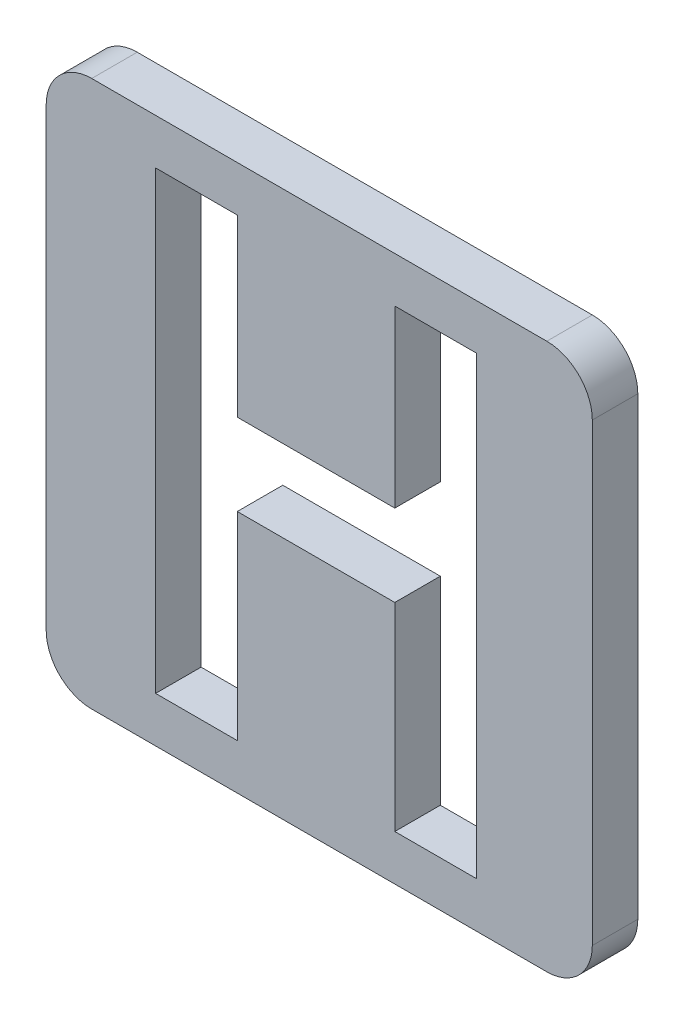
ISO-10303-21;
HEADER;
FILE_DESCRIPTION(('STEP AP214'),'2;1');
FILE_NAME('part.step','',(''),(''),'','','');
FILE_SCHEMA(('AUTOMOTIVE_DESIGN { 1 0 10303 214 1 1 1 1 }'));
ENDSEC;
DATA;
#1=APPLICATION_CONTEXT('core data for automotive mechanical design processes');
#2=APPLICATION_PROTOCOL_DEFINITION('international standard','automotive_design',2000,#1);
#3=PRODUCT_CONTEXT('',#1,'mechanical');
#4=PRODUCT('Part','Part','',(#3));
#5=PRODUCT_RELATED_PRODUCT_CATEGORY('part','',(#4));
#6=PRODUCT_DEFINITION_FORMATION('','',#4);
#7=PRODUCT_DEFINITION_CONTEXT('part definition',#1,'design');
#8=PRODUCT_DEFINITION('design','',#6,#7);
#9=PRODUCT_DEFINITION_SHAPE('','',#8);
#10=(LENGTH_UNIT() NAMED_UNIT(*) SI_UNIT(.MILLI.,.METRE.));
#11=(NAMED_UNIT(*) PLANE_ANGLE_UNIT() SI_UNIT($,.RADIAN.));
#12=(NAMED_UNIT(*) SI_UNIT($,.STERADIAN.) SOLID_ANGLE_UNIT());
#13=UNCERTAINTY_MEASURE_WITH_UNIT(LENGTH_MEASURE(1.E-05),#10,'distance_accuracy_value','');
#14=(GEOMETRIC_REPRESENTATION_CONTEXT(3) GLOBAL_UNCERTAINTY_ASSIGNED_CONTEXT((#13)) GLOBAL_UNIT_ASSIGNED_CONTEXT((#10,
#11,#12)) REPRESENTATION_CONTEXT('',''));
#15=CARTESIAN_POINT('',(0.,0.,0.));
#16=DIRECTION('',(0.,0.,1.));
#17=DIRECTION('',(1.,0.,0.));
#18=AXIS2_PLACEMENT_3D('',#15,#16,#17);
#19=CARTESIAN_POINT('',(50.,50.,10.));
#20=DIRECTION('',(0.,0.,-1.));
#21=DIRECTION('',(-1.,0.,0.));
#22=AXIS2_PLACEMENT_3D('',#19,#20,#21);
#23=PLANE('',#22);
#24=DIRECTION('',(1.,0.,0.));
#25=VECTOR('',#24,1.);
#26=CARTESIAN_POINT('',(-49.9999999999999,60.,10.));
#27=LINE('',#26,#25);
#28=CARTESIAN_POINT('',(-49.9999999999999,60.,10.));
#29=VERTEX_POINT('',#28);
#30=CARTESIAN_POINT('',(49.9999999999999,60.,10.));
#31=VERTEX_POINT('',#30);
#32=EDGE_CURVE('E265',#29,#31,#27,.T.);
#33=ORIENTED_EDGE('',*,*,#32,.F.);
#34=CARTESIAN_POINT('',(-50.,50.,10.));
#35=DIRECTION('',(0.,0.,1.));
#36=DIRECTION('',(1.,0.,0.));
#37=AXIS2_PLACEMENT_3D('',#34,#35,#36);
#38=CIRCLE('',#37,10.);
#39=CARTESIAN_POINT('',(-60.,49.9999999999999,10.));
#40=VERTEX_POINT('',#39);
#41=EDGE_CURVE('E283',#29,#40,#38,.T.);
#42=ORIENTED_EDGE('',*,*,#41,.T.);
#43=DIRECTION('',(0.,-1.,0.));
#44=VECTOR('',#43,1.);
#45=CARTESIAN_POINT('',(-60.,49.9999999999999,10.));
#46=LINE('',#45,#44);
#47=CARTESIAN_POINT('',(-60.,-49.9999999999999,10.));
#48=VERTEX_POINT('',#47);
#49=EDGE_CURVE('E281',#40,#48,#46,.T.);
#50=ORIENTED_EDGE('',*,*,#49,.T.);
#51=CARTESIAN_POINT('',(-50.,-50.,10.));
#52=DIRECTION('',(0.,0.,1.));
#53=DIRECTION('',(1.,0.,0.));
#54=AXIS2_PLACEMENT_3D('',#51,#52,#53);
#55=CIRCLE('',#54,10.);
#56=CARTESIAN_POINT('',(-49.9999999999999,-60.,10.));
#57=VERTEX_POINT('',#56);
#58=EDGE_CURVE('E279',#48,#57,#55,.T.);
#59=ORIENTED_EDGE('',*,*,#58,.T.);
#60=DIRECTION('',(1.,0.,0.));
#61=VECTOR('',#60,1.);
#62=CARTESIAN_POINT('',(-49.9999999999999,-60.,10.));
#63=LINE('',#62,#61);
#64=CARTESIAN_POINT('',(49.9999999999999,-60.,10.));
#65=VERTEX_POINT('',#64);
#66=EDGE_CURVE('E277',#57,#65,#63,.T.);
#67=ORIENTED_EDGE('',*,*,#66,.T.);
#68=CARTESIAN_POINT('',(50.,-50.,10.));
#69=DIRECTION('',(0.,0.,1.));
#70=DIRECTION('',(1.,0.,0.));
#71=AXIS2_PLACEMENT_3D('',#68,#69,#70);
#72=CIRCLE('',#71,10.);
#73=CARTESIAN_POINT('',(60.,-50.,10.));
#74=VERTEX_POINT('',#73);
#75=EDGE_CURVE('E275',#65,#74,#72,.T.);
#76=ORIENTED_EDGE('',*,*,#75,.T.);
#77=DIRECTION('',(0.,-1.,0.));
#78=VECTOR('',#77,1.);
#79=CARTESIAN_POINT('',(60.,49.9999999999999,10.));
#80=LINE('',#79,#78);
#81=CARTESIAN_POINT('',(60.,49.9999999999999,10.));
#82=VERTEX_POINT('',#81);
#83=EDGE_CURVE('E272',#82,#74,#80,.T.);
#84=ORIENTED_EDGE('',*,*,#83,.F.);
#85=CARTESIAN_POINT('',(50.,50.,10.));
#86=DIRECTION('',(0.,0.,-1.));
#87=DIRECTION('',(-1.,0.,0.));
#88=AXIS2_PLACEMENT_3D('',#85,#86,#87);
#89=CIRCLE('',#88,10.);
#90=EDGE_CURVE('E268',#31,#82,#89,.T.);
#91=ORIENTED_EDGE('',*,*,#90,.F.);
#92=EDGE_LOOP('',(#33,#42,#50,#59,#67,#76,#84,#91));
#93=FACE_BOUND('',#92,.T.);
#94=DIRECTION('',(0.,1.,0.));
#95=VECTOR('',#94,1.);
#96=CARTESIAN_POINT('',(-35.9615384615385,-50.,10.));
#97=LINE('',#96,#95);
#98=CARTESIAN_POINT('',(-35.9615384615385,-50.,10.));
#99=VERTEX_POINT('',#98);
#100=CARTESIAN_POINT('',(-35.9615384615385,50.,10.));
#101=VERTEX_POINT('',#100);
#102=EDGE_CURVE('E50',#99,#101,#97,.T.);
#103=ORIENTED_EDGE('',*,*,#102,.T.);
#104=DIRECTION('',(1.,0.,0.));
#105=VECTOR('',#104,1.);
#106=CARTESIAN_POINT('',(-35.9615384615385,50.,10.));
#107=LINE('',#106,#105);
#108=CARTESIAN_POINT('',(-18.0128205128205,50.,10.));
#109=VERTEX_POINT('',#108);
#110=EDGE_CURVE('E186',#101,#109,#107,.T.);
#111=ORIENTED_EDGE('',*,*,#110,.T.);
#112=DIRECTION('',(0.,-1.,0.));
#113=VECTOR('',#112,1.);
#114=CARTESIAN_POINT('',(-18.0128205128205,50.,10.));
#115=LINE('',#114,#113);
#116=CARTESIAN_POINT('',(-18.0128205128205,11.5384615384615,10.));
#117=VERTEX_POINT('',#116);
#118=EDGE_CURVE('E217',#109,#117,#115,.T.);
#119=ORIENTED_EDGE('',*,*,#118,.T.);
#120=DIRECTION('',(1.,0.,0.));
#121=VECTOR('',#120,1.);
#122=CARTESIAN_POINT('',(-18.0128205128205,11.5384615384615,10.));
#123=LINE('',#122,#121);
#124=CARTESIAN_POINT('',(16.6025641025641,11.5384615384615,10.));
#125=VERTEX_POINT('',#124);
#126=EDGE_CURVE('E220',#117,#125,#123,.T.);
#127=ORIENTED_EDGE('',*,*,#126,.T.);
#128=DIRECTION('',(0.,1.,0.));
#129=VECTOR('',#128,1.);
#130=CARTESIAN_POINT('',(16.6025641025641,11.5384615384615,10.));
#131=LINE('',#130,#129);
#132=CARTESIAN_POINT('',(16.6025641025641,50.,10.));
#133=VERTEX_POINT('',#132);
#134=EDGE_CURVE('E223',#125,#133,#131,.T.);
#135=ORIENTED_EDGE('',*,*,#134,.T.);
#136=DIRECTION('',(1.,0.,0.));
#137=VECTOR('',#136,1.);
#138=CARTESIAN_POINT('',(16.6025641025641,50.,10.));
#139=LINE('',#138,#137);
#140=CARTESIAN_POINT('',(34.5512820512821,50.,10.));
#141=VERTEX_POINT('',#140);
#142=EDGE_CURVE('E226',#133,#141,#139,.T.);
#143=ORIENTED_EDGE('',*,*,#142,.T.);
#144=DIRECTION('',(0.,-1.,0.));
#145=VECTOR('',#144,1.);
#146=CARTESIAN_POINT('',(34.5512820512821,50.,10.));
#147=LINE('',#146,#145);
#148=CARTESIAN_POINT('',(34.5512820512821,-50.,10.));
#149=VERTEX_POINT('',#148);
#150=EDGE_CURVE('E229',#141,#149,#147,.T.);
#151=ORIENTED_EDGE('',*,*,#150,.T.);
#152=DIRECTION('',(-1.,0.,0.));
#153=VECTOR('',#152,1.);
#154=CARTESIAN_POINT('',(34.5512820512821,-50.,10.));
#155=LINE('',#154,#153);
#156=CARTESIAN_POINT('',(16.6025641025641,-50.,10.));
#157=VERTEX_POINT('',#156);
#158=EDGE_CURVE('E232',#149,#157,#155,.T.);
#159=ORIENTED_EDGE('',*,*,#158,.T.);
#160=DIRECTION('',(0.,1.,0.));
#161=VECTOR('',#160,1.);
#162=CARTESIAN_POINT('',(16.6025641025641,-50.,10.));
#163=LINE('',#162,#161);
#164=CARTESIAN_POINT('',(16.6025641025641,-6.41025641025642,10.));
#165=VERTEX_POINT('',#164);
#166=EDGE_CURVE('E235',#157,#165,#163,.T.);
#167=ORIENTED_EDGE('',*,*,#166,.T.);
#168=DIRECTION('',(-1.,0.,0.));
#169=VECTOR('',#168,1.);
#170=CARTESIAN_POINT('',(16.6025641025641,-6.41025641025642,10.));
#171=LINE('',#170,#169);
#172=CARTESIAN_POINT('',(-18.0128205128205,-6.41025641025642,10.));
#173=VERTEX_POINT('',#172);
#174=EDGE_CURVE('E238',#165,#173,#171,.T.);
#175=ORIENTED_EDGE('',*,*,#174,.T.);
#176=DIRECTION('',(0.,-1.,0.));
#177=VECTOR('',#176,1.);
#178=CARTESIAN_POINT('',(-18.0128205128205,-6.41025641025642,10.));
#179=LINE('',#178,#177);
#180=CARTESIAN_POINT('',(-18.0128205128205,-50.,10.));
#181=VERTEX_POINT('',#180);
#182=EDGE_CURVE('E241',#173,#181,#179,.T.);
#183=ORIENTED_EDGE('',*,*,#182,.T.);
#184=DIRECTION('',(-1.,0.,0.));
#185=VECTOR('',#184,1.);
#186=CARTESIAN_POINT('',(-18.0128205128205,-50.,10.));
#187=LINE('',#186,#185);
#188=EDGE_CURVE('E180',#181,#99,#187,.T.);
#189=ORIENTED_EDGE('',*,*,#188,.T.);
#190=EDGE_LOOP('',(#103,#111,#119,#127,#135,#143,#151,#159,#167,#175,#183,#189));
#191=FACE_BOUND('',#190,.T.);
#192=ADVANCED_FACE('F33',(#93,#191),#23,.F.);
#193=CARTESIAN_POINT('',(50.,50.,0.));
#194=DIRECTION('',(0.,0.,-1.));
#195=DIRECTION('',(-1.,0.,0.));
#196=AXIS2_PLACEMENT_3D('',#193,#194,#195);
#197=PLANE('',#196);
#198=DIRECTION('',(1.,0.,0.));
#199=VECTOR('',#198,1.);
#200=CARTESIAN_POINT('',(-49.9999999999999,60.,0.));
#201=LINE('',#200,#199);
#202=CARTESIAN_POINT('',(-49.9999999999999,60.,0.));
#203=VERTEX_POINT('',#202);
#204=CARTESIAN_POINT('',(49.9999999999999,60.,0.));
#205=VERTEX_POINT('',#204);
#206=EDGE_CURVE('E187',#203,#205,#201,.T.);
#207=ORIENTED_EDGE('',*,*,#206,.T.);
#208=CARTESIAN_POINT('',(50.,50.,0.));
#209=DIRECTION('',(0.,0.,-1.));
#210=DIRECTION('',(-1.,0.,0.));
#211=AXIS2_PLACEMENT_3D('',#208,#209,#210);
#212=CIRCLE('',#211,10.);
#213=CARTESIAN_POINT('',(60.,49.9999999999999,0.));
#214=VERTEX_POINT('',#213);
#215=EDGE_CURVE('E287',#205,#214,#212,.T.);
#216=ORIENTED_EDGE('',*,*,#215,.T.);
#217=DIRECTION('',(0.,-1.,0.));
#218=VECTOR('',#217,1.);
#219=CARTESIAN_POINT('',(60.,49.9999999999999,0.));
#220=LINE('',#219,#218);
#221=CARTESIAN_POINT('',(60.,-50.,0.));
#222=VERTEX_POINT('',#221);
#223=EDGE_CURVE('E290',#214,#222,#220,.T.);
#224=ORIENTED_EDGE('',*,*,#223,.T.);
#225=CARTESIAN_POINT('',(50.,-50.,0.));
#226=DIRECTION('',(0.,0.,1.));
#227=DIRECTION('',(1.,0.,0.));
#228=AXIS2_PLACEMENT_3D('',#225,#226,#227);
#229=CIRCLE('',#228,10.);
#230=CARTESIAN_POINT('',(49.9999999999999,-60.,0.));
#231=VERTEX_POINT('',#230);
#232=EDGE_CURVE('E293',#231,#222,#229,.T.);
#233=ORIENTED_EDGE('',*,*,#232,.F.);
#234=DIRECTION('',(1.,0.,0.));
#235=VECTOR('',#234,1.);
#236=CARTESIAN_POINT('',(-49.9999999999999,-60.,0.));
#237=LINE('',#236,#235);
#238=CARTESIAN_POINT('',(-49.9999999999999,-60.,0.));
#239=VERTEX_POINT('',#238);
#240=EDGE_CURVE('E296',#239,#231,#237,.T.);
#241=ORIENTED_EDGE('',*,*,#240,.F.);
#242=CARTESIAN_POINT('',(-50.,-50.,0.));
#243=DIRECTION('',(0.,0.,1.));
#244=DIRECTION('',(1.,0.,0.));
#245=AXIS2_PLACEMENT_3D('',#242,#243,#244);
#246=CIRCLE('',#245,10.);
#247=CARTESIAN_POINT('',(-60.,-49.9999999999999,0.));
#248=VERTEX_POINT('',#247);
#249=EDGE_CURVE('E298',#248,#239,#246,.T.);
#250=ORIENTED_EDGE('',*,*,#249,.F.);
#251=DIRECTION('',(0.,-1.,0.));
#252=VECTOR('',#251,1.);
#253=CARTESIAN_POINT('',(-60.,49.9999999999999,0.));
#254=LINE('',#253,#252);
#255=CARTESIAN_POINT('',(-60.,49.9999999999999,0.));
#256=VERTEX_POINT('',#255);
#257=EDGE_CURVE('E300',#256,#248,#254,.T.);
#258=ORIENTED_EDGE('',*,*,#257,.F.);
#259=CARTESIAN_POINT('',(-50.,50.,0.));
#260=DIRECTION('',(0.,0.,1.));
#261=DIRECTION('',(1.,0.,0.));
#262=AXIS2_PLACEMENT_3D('',#259,#260,#261);
#263=CIRCLE('',#262,10.);
#264=EDGE_CURVE('E269',#203,#256,#263,.T.);
#265=ORIENTED_EDGE('',*,*,#264,.F.);
#266=EDGE_LOOP('',(#207,#216,#224,#233,#241,#250,#258,#265));
#267=FACE_BOUND('',#266,.T.);
#268=DIRECTION('',(1.,0.,0.));
#269=VECTOR('',#268,1.);
#270=CARTESIAN_POINT('',(-35.9615384615385,50.,0.));
#271=LINE('',#270,#269);
#272=CARTESIAN_POINT('',(-35.9615384615385,50.,0.));
#273=VERTEX_POINT('',#272);
#274=CARTESIAN_POINT('',(-18.0128205128205,50.,0.));
#275=VERTEX_POINT('',#274);
#276=EDGE_CURVE('E179',#273,#275,#271,.T.);
#277=ORIENTED_EDGE('',*,*,#276,.F.);
#278=DIRECTION('',(0.,1.,0.));
#279=VECTOR('',#278,1.);
#280=CARTESIAN_POINT('',(-35.9615384615385,-50.,0.));
#281=LINE('',#280,#279);
#282=CARTESIAN_POINT('',(-35.9615384615385,-50.,0.));
#283=VERTEX_POINT('',#282);
#284=EDGE_CURVE('E171',#283,#273,#281,.T.);
#285=ORIENTED_EDGE('',*,*,#284,.F.);
#286=DIRECTION('',(-1.,0.,0.));
#287=VECTOR('',#286,1.);
#288=CARTESIAN_POINT('',(-18.0128205128205,-50.,0.));
#289=LINE('',#288,#287);
#290=CARTESIAN_POINT('',(-18.0128205128205,-50.,0.));
#291=VERTEX_POINT('',#290);
#292=EDGE_CURVE('E213',#291,#283,#289,.T.);
#293=ORIENTED_EDGE('',*,*,#292,.F.);
#294=DIRECTION('',(0.,-1.,0.));
#295=VECTOR('',#294,1.);
#296=CARTESIAN_POINT('',(-18.0128205128205,-6.41025641025642,0.));
#297=LINE('',#296,#295);
#298=CARTESIAN_POINT('',(-18.0128205128205,-6.41025641025642,0.));
#299=VERTEX_POINT('',#298);
#300=EDGE_CURVE('E211',#299,#291,#297,.T.);
#301=ORIENTED_EDGE('',*,*,#300,.F.);
#302=DIRECTION('',(-1.,0.,0.));
#303=VECTOR('',#302,1.);
#304=CARTESIAN_POINT('',(16.6025641025641,-6.41025641025642,0.));
#305=LINE('',#304,#303);
#306=CARTESIAN_POINT('',(16.6025641025641,-6.41025641025642,0.));
#307=VERTEX_POINT('',#306);
#308=EDGE_CURVE('E209',#307,#299,#305,.T.);
#309=ORIENTED_EDGE('',*,*,#308,.F.);
#310=DIRECTION('',(0.,1.,0.));
#311=VECTOR('',#310,1.);
#312=CARTESIAN_POINT('',(16.6025641025641,-50.,0.));
#313=LINE('',#312,#311);
#314=CARTESIAN_POINT('',(16.6025641025641,-50.,0.));
#315=VERTEX_POINT('',#314);
#316=EDGE_CURVE('E207',#315,#307,#313,.T.);
#317=ORIENTED_EDGE('',*,*,#316,.F.);
#318=DIRECTION('',(-1.,0.,0.));
#319=VECTOR('',#318,1.);
#320=CARTESIAN_POINT('',(34.5512820512821,-50.,0.));
#321=LINE('',#320,#319);
#322=CARTESIAN_POINT('',(34.5512820512821,-50.,0.));
#323=VERTEX_POINT('',#322);
#324=EDGE_CURVE('E205',#323,#315,#321,.T.);
#325=ORIENTED_EDGE('',*,*,#324,.F.);
#326=DIRECTION('',(0.,-1.,0.));
#327=VECTOR('',#326,1.);
#328=CARTESIAN_POINT('',(34.5512820512821,50.,0.));
#329=LINE('',#328,#327);
#330=CARTESIAN_POINT('',(34.5512820512821,50.,0.));
#331=VERTEX_POINT('',#330);
#332=EDGE_CURVE('E203',#331,#323,#329,.T.);
#333=ORIENTED_EDGE('',*,*,#332,.F.);
#334=DIRECTION('',(1.,0.,0.));
#335=VECTOR('',#334,1.);
#336=CARTESIAN_POINT('',(16.6025641025641,50.,0.));
#337=LINE('',#336,#335);
#338=CARTESIAN_POINT('',(16.6025641025641,50.,0.));
#339=VERTEX_POINT('',#338);
#340=EDGE_CURVE('E201',#339,#331,#337,.T.);
#341=ORIENTED_EDGE('',*,*,#340,.F.);
#342=DIRECTION('',(0.,1.,0.));
#343=VECTOR('',#342,1.);
#344=CARTESIAN_POINT('',(16.6025641025641,11.5384615384615,0.));
#345=LINE('',#344,#343);
#346=CARTESIAN_POINT('',(16.6025641025641,11.5384615384615,0.));
#347=VERTEX_POINT('',#346);
#348=EDGE_CURVE('E199',#347,#339,#345,.T.);
#349=ORIENTED_EDGE('',*,*,#348,.F.);
#350=DIRECTION('',(1.,0.,0.));
#351=VECTOR('',#350,1.);
#352=CARTESIAN_POINT('',(-18.0128205128205,11.5384615384615,0.));
#353=LINE('',#352,#351);
#354=CARTESIAN_POINT('',(-18.0128205128205,11.5384615384615,0.));
#355=VERTEX_POINT('',#354);
#356=EDGE_CURVE('E195',#355,#347,#353,.T.);
#357=ORIENTED_EDGE('',*,*,#356,.F.);
#358=DIRECTION('',(0.,-1.,0.));
#359=VECTOR('',#358,1.);
#360=CARTESIAN_POINT('',(-18.0128205128205,50.,0.));
#361=LINE('',#360,#359);
#362=EDGE_CURVE('E193',#275,#355,#361,.T.);
#363=ORIENTED_EDGE('',*,*,#362,.F.);
#364=EDGE_LOOP('',(#277,#285,#293,#301,#309,#317,#325,#333,#341,#349,#357,#363));
#365=FACE_BOUND('',#364,.T.);
#366=ADVANCED_FACE('F191',(#267,#365),#197,.T.);
#367=CARTESIAN_POINT('',(-49.9999999999999,60.,10.));
#368=DIRECTION('',(0.,1.,0.));
#369=DIRECTION('',(0.,0.,1.));
#370=AXIS2_PLACEMENT_3D('',#367,#368,#369);
#371=PLANE('',#370);
#372=ORIENTED_EDGE('',*,*,#206,.F.);
#373=DIRECTION('',(0.,0.,-1.));
#374=VECTOR('',#373,1.);
#375=CARTESIAN_POINT('',(-49.9999999999999,60.,10.));
#376=LINE('',#375,#374);
#377=EDGE_CURVE('E11',#29,#203,#376,.T.);
#378=ORIENTED_EDGE('',*,*,#377,.F.);
#379=ORIENTED_EDGE('',*,*,#32,.T.);
#380=DIRECTION('',(0.,0.,-1.));
#381=VECTOR('',#380,1.);
#382=CARTESIAN_POINT('',(49.9999999999999,60.,10.));
#383=LINE('',#382,#381);
#384=EDGE_CURVE('E37',#31,#205,#383,.T.);
#385=ORIENTED_EDGE('',*,*,#384,.T.);
#386=EDGE_LOOP('',(#372,#378,#379,#385));
#387=FACE_BOUND('',#386,.T.);
#388=ADVANCED_FACE('F35',(#387),#371,.T.);
#389=CARTESIAN_POINT('',(-50.,50.,10.));
#390=DIRECTION('',(0.,0.,-1.));
#391=DIRECTION('',(-1.,0.,0.));
#392=AXIS2_PLACEMENT_3D('',#389,#390,#391);
#393=CYLINDRICAL_SURFACE('',#392,10.);
#394=ORIENTED_EDGE('',*,*,#264,.T.);
#395=DIRECTION('',(0.,0.,-1.));
#396=VECTOR('',#395,1.);
#397=CARTESIAN_POINT('',(-60.,49.9999999999999,10.));
#398=LINE('',#397,#396);
#399=EDGE_CURVE('E42',#40,#256,#398,.T.);
#400=ORIENTED_EDGE('',*,*,#399,.F.);
#401=ORIENTED_EDGE('',*,*,#41,.F.);
#402=ORIENTED_EDGE('',*,*,#377,.T.);
#403=EDGE_LOOP('',(#394,#400,#401,#402));
#404=FACE_BOUND('',#403,.T.);
#405=ADVANCED_FACE('F330',(#404),#393,.T.);
#406=CARTESIAN_POINT('',(-60.,49.9999999999999,10.));
#407=DIRECTION('',(1.,0.,0.));
#408=DIRECTION('',(0.,1.,0.));
#409=AXIS2_PLACEMENT_3D('',#406,#407,#408);
#410=PLANE('',#409);
#411=ORIENTED_EDGE('',*,*,#257,.T.);
#412=DIRECTION('',(0.,0.,-1.));
#413=VECTOR('',#412,1.);
#414=CARTESIAN_POINT('',(-60.,-49.9999999999999,10.));
#415=LINE('',#414,#413);
#416=EDGE_CURVE('E305',#48,#248,#415,.T.);
#417=ORIENTED_EDGE('',*,*,#416,.F.);
#418=ORIENTED_EDGE('',*,*,#49,.F.);
#419=ORIENTED_EDGE('',*,*,#399,.T.);
#420=EDGE_LOOP('',(#411,#417,#418,#419));
#421=FACE_BOUND('',#420,.T.);
#422=ADVANCED_FACE('F334',(#421),#410,.F.);
#423=CARTESIAN_POINT('',(-50.,-50.,10.));
#424=DIRECTION('',(0.,0.,-1.));
#425=DIRECTION('',(-1.,0.,0.));
#426=AXIS2_PLACEMENT_3D('',#423,#424,#425);
#427=CYLINDRICAL_SURFACE('',#426,10.);
#428=ORIENTED_EDGE('',*,*,#249,.T.);
#429=DIRECTION('',(0.,0.,-1.));
#430=VECTOR('',#429,1.);
#431=CARTESIAN_POINT('',(-49.9999999999999,-60.,10.));
#432=LINE('',#431,#430);
#433=EDGE_CURVE('E308',#57,#239,#432,.T.);
#434=ORIENTED_EDGE('',*,*,#433,.F.);
#435=ORIENTED_EDGE('',*,*,#58,.F.);
#436=ORIENTED_EDGE('',*,*,#416,.T.);
#437=EDGE_LOOP('',(#428,#434,#435,#436));
#438=FACE_BOUND('',#437,.T.);
#439=ADVANCED_FACE('F354',(#438),#427,.T.);
#440=CARTESIAN_POINT('',(-49.9999999999999,-60.,10.));
#441=DIRECTION('',(0.,1.,0.));
#442=DIRECTION('',(0.,0.,1.));
#443=AXIS2_PLACEMENT_3D('',#440,#441,#442);
#444=PLANE('',#443);
#445=ORIENTED_EDGE('',*,*,#240,.T.);
#446=DIRECTION('',(0.,0.,-1.));
#447=VECTOR('',#446,1.);
#448=CARTESIAN_POINT('',(49.9999999999999,-60.,10.));
#449=LINE('',#448,#447);
#450=EDGE_CURVE('E311',#65,#231,#449,.T.);
#451=ORIENTED_EDGE('',*,*,#450,.F.);
#452=ORIENTED_EDGE('',*,*,#66,.F.);
#453=ORIENTED_EDGE('',*,*,#433,.T.);
#454=EDGE_LOOP('',(#445,#451,#452,#453));
#455=FACE_BOUND('',#454,.T.);
#456=ADVANCED_FACE('F352',(#455),#444,.F.);
#457=CARTESIAN_POINT('',(50.,-50.,10.));
#458=DIRECTION('',(0.,0.,-1.));
#459=DIRECTION('',(-1.,0.,0.));
#460=AXIS2_PLACEMENT_3D('',#457,#458,#459);
#461=CYLINDRICAL_SURFACE('',#460,10.);
#462=ORIENTED_EDGE('',*,*,#232,.T.);
#463=DIRECTION('',(0.,0.,-1.));
#464=VECTOR('',#463,1.);
#465=CARTESIAN_POINT('',(60.,-50.,10.));
#466=LINE('',#465,#464);
#467=EDGE_CURVE('E314',#74,#222,#466,.T.);
#468=ORIENTED_EDGE('',*,*,#467,.F.);
#469=ORIENTED_EDGE('',*,*,#75,.F.);
#470=ORIENTED_EDGE('',*,*,#450,.T.);
#471=EDGE_LOOP('',(#462,#468,#469,#470));
#472=FACE_BOUND('',#471,.T.);
#473=ADVANCED_FACE('F348',(#472),#461,.T.);
#474=CARTESIAN_POINT('',(60.,49.9999999999999,10.));
#475=DIRECTION('',(1.,0.,0.));
#476=DIRECTION('',(0.,1.,0.));
#477=AXIS2_PLACEMENT_3D('',#474,#475,#476);
#478=PLANE('',#477);
#479=ORIENTED_EDGE('',*,*,#223,.F.);
#480=DIRECTION('',(0.,0.,-1.));
#481=VECTOR('',#480,1.);
#482=CARTESIAN_POINT('',(60.,49.9999999999999,10.));
#483=LINE('',#482,#481);
#484=EDGE_CURVE('E315',#82,#214,#483,.T.);
#485=ORIENTED_EDGE('',*,*,#484,.F.);
#486=ORIENTED_EDGE('',*,*,#83,.T.);
#487=ORIENTED_EDGE('',*,*,#467,.T.);
#488=EDGE_LOOP('',(#479,#485,#486,#487));
#489=FACE_BOUND('',#488,.T.);
#490=ADVANCED_FACE('F344',(#489),#478,.T.);
#491=CARTESIAN_POINT('',(50.,50.,10.));
#492=DIRECTION('',(0.,0.,-1.));
#493=DIRECTION('',(-1.,0.,0.));
#494=AXIS2_PLACEMENT_3D('',#491,#492,#493);
#495=CYLINDRICAL_SURFACE('',#494,10.);
#496=ORIENTED_EDGE('',*,*,#215,.F.);
#497=ORIENTED_EDGE('',*,*,#384,.F.);
#498=ORIENTED_EDGE('',*,*,#90,.T.);
#499=ORIENTED_EDGE('',*,*,#484,.T.);
#500=EDGE_LOOP('',(#496,#497,#498,#499));
#501=FACE_BOUND('',#500,.T.);
#502=ADVANCED_FACE('F323',(#501),#495,.T.);
#503=CARTESIAN_POINT('',(-35.9615384615385,-50.,0.));
#504=DIRECTION('',(1.,0.,0.));
#505=DIRECTION('',(0.,0.,-1.));
#506=AXIS2_PLACEMENT_3D('',#503,#504,#505);
#507=PLANE('',#506);
#508=ORIENTED_EDGE('',*,*,#102,.F.);
#509=DIRECTION('',(0.,0.,1.));
#510=VECTOR('',#509,1.);
#511=CARTESIAN_POINT('',(-35.9615384615385,-50.,0.));
#512=LINE('',#511,#510);
#513=EDGE_CURVE('E175',#283,#99,#512,.T.);
#514=ORIENTED_EDGE('',*,*,#513,.F.);
#515=ORIENTED_EDGE('',*,*,#284,.T.);
#516=DIRECTION('',(0.,0.,1.));
#517=VECTOR('',#516,1.);
#518=CARTESIAN_POINT('',(-35.9615384615385,50.,0.));
#519=LINE('',#518,#517);
#520=EDGE_CURVE('E174',#273,#101,#519,.T.);
#521=ORIENTED_EDGE('',*,*,#520,.T.);
#522=EDGE_LOOP('',(#508,#514,#515,#521));
#523=FACE_BOUND('',#522,.T.);
#524=ADVANCED_FACE('F173',(#523),#507,.T.);
#525=CARTESIAN_POINT('',(-35.9615384615385,50.,0.));
#526=DIRECTION('',(0.,-1.,0.));
#527=DIRECTION('',(0.,0.,-1.));
#528=AXIS2_PLACEMENT_3D('',#525,#526,#527);
#529=PLANE('',#528);
#530=ORIENTED_EDGE('',*,*,#110,.F.);
#531=ORIENTED_EDGE('',*,*,#520,.F.);
#532=ORIENTED_EDGE('',*,*,#276,.T.);
#533=DIRECTION('',(0.,0.,1.));
#534=VECTOR('',#533,1.);
#535=CARTESIAN_POINT('',(-18.0128205128205,50.,0.));
#536=LINE('',#535,#534);
#537=EDGE_CURVE('E188',#275,#109,#536,.T.);
#538=ORIENTED_EDGE('',*,*,#537,.T.);
#539=EDGE_LOOP('',(#530,#531,#532,#538));
#540=FACE_BOUND('',#539,.T.);
#541=ADVANCED_FACE('F183',(#540),#529,.T.);
#542=CARTESIAN_POINT('',(-18.0128205128205,50.,0.));
#543=DIRECTION('',(-1.,0.,0.));
#544=DIRECTION('',(0.,0.,1.));
#545=AXIS2_PLACEMENT_3D('',#542,#543,#544);
#546=PLANE('',#545);
#547=ORIENTED_EDGE('',*,*,#118,.F.);
#548=ORIENTED_EDGE('',*,*,#537,.F.);
#549=ORIENTED_EDGE('',*,*,#362,.T.);
#550=DIRECTION('',(0.,0.,1.));
#551=VECTOR('',#550,1.);
#552=CARTESIAN_POINT('',(-18.0128205128205,11.5384615384615,0.));
#553=LINE('',#552,#551);
#554=EDGE_CURVE('E262',#355,#117,#553,.T.);
#555=ORIENTED_EDGE('',*,*,#554,.T.);
#556=EDGE_LOOP('',(#547,#548,#549,#555));
#557=FACE_BOUND('',#556,.T.);
#558=ADVANCED_FACE('F403',(#557),#546,.T.);
#559=CARTESIAN_POINT('',(-18.0128205128205,11.5384615384615,0.));
#560=DIRECTION('',(0.,-1.,0.));
#561=DIRECTION('',(0.,0.,-1.));
#562=AXIS2_PLACEMENT_3D('',#559,#560,#561);
#563=PLANE('',#562);
#564=ORIENTED_EDGE('',*,*,#126,.F.);
#565=ORIENTED_EDGE('',*,*,#554,.F.);
#566=ORIENTED_EDGE('',*,*,#356,.T.);
#567=DIRECTION('',(0.,0.,1.));
#568=VECTOR('',#567,1.);
#569=CARTESIAN_POINT('',(16.6025641025641,11.5384615384615,0.));
#570=LINE('',#569,#568);
#571=EDGE_CURVE('E260',#347,#125,#570,.T.);
#572=ORIENTED_EDGE('',*,*,#571,.T.);
#573=EDGE_LOOP('',(#564,#565,#566,#572));
#574=FACE_BOUND('',#573,.T.);
#575=ADVANCED_FACE('F411',(#574),#563,.T.);
#576=CARTESIAN_POINT('',(16.6025641025641,11.5384615384615,0.));
#577=DIRECTION('',(1.,0.,0.));
#578=DIRECTION('',(0.,0.,-1.));
#579=AXIS2_PLACEMENT_3D('',#576,#577,#578);
#580=PLANE('',#579);
#581=ORIENTED_EDGE('',*,*,#134,.F.);
#582=ORIENTED_EDGE('',*,*,#571,.F.);
#583=ORIENTED_EDGE('',*,*,#348,.T.);
#584=DIRECTION('',(0.,0.,1.));
#585=VECTOR('',#584,1.);
#586=CARTESIAN_POINT('',(16.6025641025641,50.,0.));
#587=LINE('',#586,#585);
#588=EDGE_CURVE('E258',#339,#133,#587,.T.);
#589=ORIENTED_EDGE('',*,*,#588,.T.);
#590=EDGE_LOOP('',(#581,#582,#583,#589));
#591=FACE_BOUND('',#590,.T.);
#592=ADVANCED_FACE('F421',(#591),#580,.T.);
#593=CARTESIAN_POINT('',(16.6025641025641,50.,0.));
#594=DIRECTION('',(0.,-1.,0.));
#595=DIRECTION('',(0.,0.,-1.));
#596=AXIS2_PLACEMENT_3D('',#593,#594,#595);
#597=PLANE('',#596);
#598=ORIENTED_EDGE('',*,*,#142,.F.);
#599=ORIENTED_EDGE('',*,*,#588,.F.);
#600=ORIENTED_EDGE('',*,*,#340,.T.);
#601=DIRECTION('',(0.,0.,1.));
#602=VECTOR('',#601,1.);
#603=CARTESIAN_POINT('',(34.5512820512821,50.,0.));
#604=LINE('',#603,#602);
#605=EDGE_CURVE('E256',#331,#141,#604,.T.);
#606=ORIENTED_EDGE('',*,*,#605,.T.);
#607=EDGE_LOOP('',(#598,#599,#600,#606));
#608=FACE_BOUND('',#607,.T.);
#609=ADVANCED_FACE('F431',(#608),#597,.T.);
#610=CARTESIAN_POINT('',(34.5512820512821,50.,0.));
#611=DIRECTION('',(-1.,0.,0.));
#612=DIRECTION('',(0.,0.,1.));
#613=AXIS2_PLACEMENT_3D('',#610,#611,#612);
#614=PLANE('',#613);
#615=ORIENTED_EDGE('',*,*,#150,.F.);
#616=ORIENTED_EDGE('',*,*,#605,.F.);
#617=ORIENTED_EDGE('',*,*,#332,.T.);
#618=DIRECTION('',(0.,0.,1.));
#619=VECTOR('',#618,1.);
#620=CARTESIAN_POINT('',(34.5512820512821,-50.,0.));
#621=LINE('',#620,#619);
#622=EDGE_CURVE('E254',#323,#149,#621,.T.);
#623=ORIENTED_EDGE('',*,*,#622,.T.);
#624=EDGE_LOOP('',(#615,#616,#617,#623));
#625=FACE_BOUND('',#624,.T.);
#626=ADVANCED_FACE('F441',(#625),#614,.T.);
#627=CARTESIAN_POINT('',(34.5512820512821,-50.,0.));
#628=DIRECTION('',(0.,1.,0.));
#629=DIRECTION('',(0.,0.,1.));
#630=AXIS2_PLACEMENT_3D('',#627,#628,#629);
#631=PLANE('',#630);
#632=ORIENTED_EDGE('',*,*,#158,.F.);
#633=ORIENTED_EDGE('',*,*,#622,.F.);
#634=ORIENTED_EDGE('',*,*,#324,.T.);
#635=DIRECTION('',(0.,0.,1.));
#636=VECTOR('',#635,1.);
#637=CARTESIAN_POINT('',(16.6025641025641,-50.,0.));
#638=LINE('',#637,#636);
#639=EDGE_CURVE('E252',#315,#157,#638,.T.);
#640=ORIENTED_EDGE('',*,*,#639,.T.);
#641=EDGE_LOOP('',(#632,#633,#634,#640));
#642=FACE_BOUND('',#641,.T.);
#643=ADVANCED_FACE('F451',(#642),#631,.T.);
#644=CARTESIAN_POINT('',(16.6025641025641,-50.,0.));
#645=DIRECTION('',(1.,0.,0.));
#646=DIRECTION('',(0.,0.,-1.));
#647=AXIS2_PLACEMENT_3D('',#644,#645,#646);
#648=PLANE('',#647);
#649=ORIENTED_EDGE('',*,*,#166,.F.);
#650=ORIENTED_EDGE('',*,*,#639,.F.);
#651=ORIENTED_EDGE('',*,*,#316,.T.);
#652=DIRECTION('',(0.,0.,1.));
#653=VECTOR('',#652,1.);
#654=CARTESIAN_POINT('',(16.6025641025641,-6.41025641025642,0.));
#655=LINE('',#654,#653);
#656=EDGE_CURVE('E250',#307,#165,#655,.T.);
#657=ORIENTED_EDGE('',*,*,#656,.T.);
#658=EDGE_LOOP('',(#649,#650,#651,#657));
#659=FACE_BOUND('',#658,.T.);
#660=ADVANCED_FACE('F461',(#659),#648,.T.);
#661=CARTESIAN_POINT('',(16.6025641025641,-6.41025641025642,0.));
#662=DIRECTION('',(0.,1.,0.));
#663=DIRECTION('',(0.,0.,1.));
#664=AXIS2_PLACEMENT_3D('',#661,#662,#663);
#665=PLANE('',#664);
#666=ORIENTED_EDGE('',*,*,#174,.F.);
#667=ORIENTED_EDGE('',*,*,#656,.F.);
#668=ORIENTED_EDGE('',*,*,#308,.T.);
#669=DIRECTION('',(0.,0.,1.));
#670=VECTOR('',#669,1.);
#671=CARTESIAN_POINT('',(-18.0128205128205,-6.41025641025642,0.));
#672=LINE('',#671,#670);
#673=EDGE_CURVE('E248',#299,#173,#672,.T.);
#674=ORIENTED_EDGE('',*,*,#673,.T.);
#675=EDGE_LOOP('',(#666,#667,#668,#674));
#676=FACE_BOUND('',#675,.T.);
#677=ADVANCED_FACE('F471',(#676),#665,.T.);
#678=CARTESIAN_POINT('',(-18.0128205128205,-6.41025641025642,0.));
#679=DIRECTION('',(-1.,0.,0.));
#680=DIRECTION('',(0.,0.,1.));
#681=AXIS2_PLACEMENT_3D('',#678,#679,#680);
#682=PLANE('',#681);
#683=ORIENTED_EDGE('',*,*,#182,.F.);
#684=ORIENTED_EDGE('',*,*,#673,.F.);
#685=ORIENTED_EDGE('',*,*,#300,.T.);
#686=DIRECTION('',(0.,0.,1.));
#687=VECTOR('',#686,1.);
#688=CARTESIAN_POINT('',(-18.0128205128205,-50.,0.));
#689=LINE('',#688,#687);
#690=EDGE_CURVE('E58',#291,#181,#689,.T.);
#691=ORIENTED_EDGE('',*,*,#690,.T.);
#692=EDGE_LOOP('',(#683,#684,#685,#691));
#693=FACE_BOUND('',#692,.T.);
#694=ADVANCED_FACE('F481',(#693),#682,.T.);
#695=CARTESIAN_POINT('',(-18.0128205128205,-50.,0.));
#696=DIRECTION('',(0.,1.,0.));
#697=DIRECTION('',(0.,0.,1.));
#698=AXIS2_PLACEMENT_3D('',#695,#696,#697);
#699=PLANE('',#698);
#700=ORIENTED_EDGE('',*,*,#188,.F.);
#701=ORIENTED_EDGE('',*,*,#690,.F.);
#702=ORIENTED_EDGE('',*,*,#292,.T.);
#703=ORIENTED_EDGE('',*,*,#513,.T.);
#704=EDGE_LOOP('',(#700,#701,#702,#703));
#705=FACE_BOUND('',#704,.T.);
#706=ADVANCED_FACE('F491',(#705),#699,.T.);
#707=CLOSED_SHELL('',(#192,#366,#388,#405,#422,#439,#456,#473,#490,#502,#524,#541,#558,#575,
#592,#609,#626,#643,#660,#677,#694,#706));
#708=MANIFOLD_SOLID_BREP('B2',#707);
#709=ADVANCED_BREP_SHAPE_REPRESENTATION('',(#18,#708),#14);
#710=SHAPE_DEFINITION_REPRESENTATION(#9,#709);
ENDSEC;
END-ISO-10303-21;
